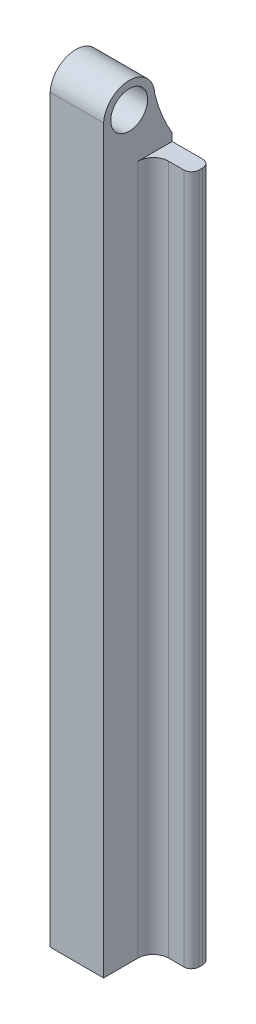
ISO-10303-21;
HEADER;
FILE_DESCRIPTION(('STEP AP214'),'2;1');
FILE_NAME('part.step','',(''),(''),'','','');
FILE_SCHEMA(('AUTOMOTIVE_DESIGN { 1 0 10303 214 1 1 1 1 }'));
ENDSEC;
DATA;
#1=APPLICATION_CONTEXT('core data for automotive mechanical design processes');
#2=APPLICATION_PROTOCOL_DEFINITION('international standard','automotive_design',2000,#1);
#3=PRODUCT_CONTEXT('',#1,'mechanical');
#4=PRODUCT('Part','Part','',(#3));
#5=PRODUCT_RELATED_PRODUCT_CATEGORY('part','',(#4));
#6=PRODUCT_DEFINITION_FORMATION('','',#4);
#7=PRODUCT_DEFINITION_CONTEXT('part definition',#1,'design');
#8=PRODUCT_DEFINITION('design','',#6,#7);
#9=PRODUCT_DEFINITION_SHAPE('','',#8);
#10=(LENGTH_UNIT() NAMED_UNIT(*) SI_UNIT(.MILLI.,.METRE.));
#11=(NAMED_UNIT(*) PLANE_ANGLE_UNIT() SI_UNIT($,.RADIAN.));
#12=(NAMED_UNIT(*) SI_UNIT($,.STERADIAN.) SOLID_ANGLE_UNIT());
#13=UNCERTAINTY_MEASURE_WITH_UNIT(LENGTH_MEASURE(1.E-05),#10,'distance_accuracy_value','');
#14=(GEOMETRIC_REPRESENTATION_CONTEXT(3) GLOBAL_UNCERTAINTY_ASSIGNED_CONTEXT((#13)) GLOBAL_UNIT_ASSIGNED_CONTEXT((#10,
#11,#12)) REPRESENTATION_CONTEXT('',''));
#15=CARTESIAN_POINT('',(0.,0.,0.));
#16=DIRECTION('',(0.,0.,1.));
#17=DIRECTION('',(1.,0.,0.));
#18=AXIS2_PLACEMENT_3D('',#15,#16,#17);
#19=CARTESIAN_POINT('',(0.,154.432,11.43));
#20=DIRECTION('',(-1.,0.,0.));
#21=DIRECTION('',(0.,0.,1.));
#22=AXIS2_PLACEMENT_3D('',#19,#20,#21);
#23=PLANE('',#22);
#24=DIRECTION('',(0.,0.,-1.));
#25=VECTOR('',#24,1.);
#26=CARTESIAN_POINT('',(0.,141.732,11.43));
#27=LINE('',#26,#25);
#28=CARTESIAN_POINT('',(0.,141.732,1.87439950990867));
#29=VERTEX_POINT('',#28);
#30=CARTESIAN_POINT('',(0.,141.732,1.27));
#31=VERTEX_POINT('',#30);
#32=EDGE_CURVE('E373',#29,#31,#27,.T.);
#33=ORIENTED_EDGE('',*,*,#32,.F.);
#34=DIRECTION('',(0.,1.,0.));
#35=VECTOR('',#34,1.);
#36=CARTESIAN_POINT('',(0.,0.,1.87439950990867));
#37=LINE('',#36,#35);
#38=CARTESIAN_POINT('',(0.,26.67,1.87439950990867));
#39=VERTEX_POINT('',#38);
#40=EDGE_CURVE('E257',#29,#39,#37,.F.);
#41=ORIENTED_EDGE('',*,*,#40,.T.);
#42=DIRECTION('',(0.,0.,1.));
#43=VECTOR('',#42,1.);
#44=CARTESIAN_POINT('',(0.,26.67,0.));
#45=LINE('',#44,#43);
#46=CARTESIAN_POINT('',(0.,26.67,1.27));
#47=VERTEX_POINT('',#46);
#48=EDGE_CURVE('E360',#47,#39,#45,.T.);
#49=ORIENTED_EDGE('',*,*,#48,.F.);
#50=DIRECTION('',(0.,-1.,0.));
#51=VECTOR('',#50,1.);
#52=CARTESIAN_POINT('',(0.,154.432,1.27));
#53=LINE('',#52,#51);
#54=EDGE_CURVE('E339',#47,#31,#53,.F.);
#55=ORIENTED_EDGE('',*,*,#54,.T.);
#56=EDGE_LOOP('',(#33,#41,#49,#55));
#57=FACE_BOUND('',#56,.T.);
#58=ADVANCED_FACE('F35',(#57),#23,.F.);
#59=CARTESIAN_POINT('',(0.,154.432,0.));
#60=DIRECTION('',(0.,0.,1.));
#61=DIRECTION('',(1.,0.,0.));
#62=AXIS2_PLACEMENT_3D('',#59,#60,#61);
#63=PLANE('',#62);
#64=DIRECTION('',(0.,-1.,0.));
#65=VECTOR('',#64,1.);
#66=CARTESIAN_POINT('',(-15.2731717145884,154.432,0.));
#67=LINE('',#66,#65);
#68=CARTESIAN_POINT('',(-15.2731717145884,143.002,0.));
#69=VERTEX_POINT('',#68);
#70=CARTESIAN_POINT('',(-15.2731717145884,141.732,0.));
#71=VERTEX_POINT('',#70);
#72=EDGE_CURVE('E380',#69,#71,#67,.T.);
#73=ORIENTED_EDGE('',*,*,#72,.F.);
#74=DIRECTION('',(1.,0.,0.));
#75=VECTOR('',#74,1.);
#76=CARTESIAN_POINT('',(-196.96148304681,143.002,0.));
#77=LINE('',#76,#75);
#78=CARTESIAN_POINT('',(-6.36373498617226,143.002,0.));
#79=VERTEX_POINT('',#78);
#80=EDGE_CURVE('E172',#69,#79,#77,.T.);
#81=ORIENTED_EDGE('',*,*,#80,.T.);
#82=DIRECTION('',(0.,-1.,0.));
#83=VECTOR('',#82,1.);
#84=CARTESIAN_POINT('',(-6.36373498617226,154.432,0.));
#85=LINE('',#84,#83);
#86=CARTESIAN_POINT('',(-6.36373498617226,141.732,0.));
#87=VERTEX_POINT('',#86);
#88=EDGE_CURVE('E161',#79,#87,#85,.T.);
#89=ORIENTED_EDGE('',*,*,#88,.T.);
#90=DIRECTION('',(1.,0.,0.));
#91=VECTOR('',#90,1.);
#92=CARTESIAN_POINT('',(-6.36373498617226,141.732,0.));
#93=LINE('',#92,#91);
#94=CARTESIAN_POINT('',(-1.27,141.732,0.));
#95=VERTEX_POINT('',#94);
#96=EDGE_CURVE('E398',#87,#95,#93,.T.);
#97=ORIENTED_EDGE('',*,*,#96,.T.);
#98=DIRECTION('',(0.,-1.,0.));
#99=VECTOR('',#98,1.);
#100=CARTESIAN_POINT('',(-1.27,154.432,0.));
#101=LINE('',#100,#99);
#102=CARTESIAN_POINT('',(-1.27,26.67,0.));
#103=VERTEX_POINT('',#102);
#104=EDGE_CURVE('E337',#95,#103,#101,.T.);
#105=ORIENTED_EDGE('',*,*,#104,.T.);
#106=DIRECTION('',(1.,0.,0.));
#107=VECTOR('',#106,1.);
#108=CARTESIAN_POINT('',(-21.5957535189019,26.67,0.));
#109=LINE('',#108,#107);
#110=CARTESIAN_POINT('',(-20.3257535189019,26.67,0.));
#111=VERTEX_POINT('',#110);
#112=EDGE_CURVE('E299',#111,#103,#109,.T.);
#113=ORIENTED_EDGE('',*,*,#112,.F.);
#114=DIRECTION('',(0.,-1.,0.));
#115=VECTOR('',#114,1.);
#116=CARTESIAN_POINT('',(-20.3257535189019,154.432,0.));
#117=LINE('',#116,#115);
#118=CARTESIAN_POINT('',(-20.3257535189019,141.732,0.));
#119=VERTEX_POINT('',#118);
#120=EDGE_CURVE('E334',#111,#119,#117,.F.);
#121=ORIENTED_EDGE('',*,*,#120,.T.);
#122=DIRECTION('',(-1.,0.,0.));
#123=VECTOR('',#122,1.);
#124=CARTESIAN_POINT('',(-15.2731717145884,141.732,0.));
#125=LINE('',#124,#123);
#126=EDGE_CURVE('E382',#71,#119,#125,.T.);
#127=ORIENTED_EDGE('',*,*,#126,.F.);
#128=EDGE_LOOP('',(#73,#81,#89,#97,#105,#113,#121,#127));
#129=FACE_BOUND('',#128,.T.);
#130=ADVANCED_FACE('F216',(#129),#63,.F.);
#131=CARTESIAN_POINT('',(-6.36373498617226,-30.48,3.14439950990867));
#132=DIRECTION('',(0.,0.,1.));
#133=DIRECTION('',(1.,0.,0.));
#134=AXIS2_PLACEMENT_3D('',#131,#132,#133);
#135=PLANE('',#134);
#136=DIRECTION('',(0.,1.,0.));
#137=VECTOR('',#136,1.);
#138=CARTESIAN_POINT('',(-1.27,154.432,3.14439950990867));
#139=LINE('',#138,#137);
#140=CARTESIAN_POINT('',(-1.27,26.67,3.14439950990867));
#141=VERTEX_POINT('',#140);
#142=CARTESIAN_POINT('',(-1.27,141.732,3.14439950990867));
#143=VERTEX_POINT('',#142);
#144=EDGE_CURVE('E265',#141,#143,#139,.T.);
#145=ORIENTED_EDGE('',*,*,#144,.T.);
#146=DIRECTION('',(-1.,0.,0.));
#147=VECTOR('',#146,1.);
#148=CARTESIAN_POINT('',(-6.36373498617226,141.732,3.14439950990867));
#149=LINE('',#148,#147);
#150=CARTESIAN_POINT('',(-3.82373498617226,141.732,3.14439950990867));
#151=VERTEX_POINT('',#150);
#152=EDGE_CURVE('E347',#143,#151,#149,.T.);
#153=ORIENTED_EDGE('',*,*,#152,.T.);
#154=DIRECTION('',(0.,1.,0.));
#155=VECTOR('',#154,1.);
#156=CARTESIAN_POINT('',(-3.82373498617226,0.,3.14439950990867));
#157=LINE('',#156,#155);
#158=CARTESIAN_POINT('',(-3.82373498617226,26.67,3.14439950990867));
#159=VERTEX_POINT('',#158);
#160=EDGE_CURVE('E270',#151,#159,#157,.F.);
#161=ORIENTED_EDGE('',*,*,#160,.T.);
#162=DIRECTION('',(1.,0.,0.));
#163=VECTOR('',#162,1.);
#164=CARTESIAN_POINT('',(-6.36373498617226,26.67,3.14439950990867));
#165=LINE('',#164,#163);
#166=EDGE_CURVE('E304',#159,#141,#165,.T.);
#167=ORIENTED_EDGE('',*,*,#166,.T.);
#168=EDGE_LOOP('',(#145,#153,#161,#167));
#169=FACE_BOUND('',#168,.T.);
#170=ADVANCED_FACE('F212',(#169),#135,.T.);
#171=CARTESIAN_POINT('',(-1.27,154.432,1.27));
#172=DIRECTION('',(0.,-1.,0.));
#173=DIRECTION('',(0.,0.,-1.));
#174=AXIS2_PLACEMENT_3D('',#171,#172,#173);
#175=CYLINDRICAL_SURFACE('',#174,1.27);
#176=ORIENTED_EDGE('',*,*,#104,.F.);
#177=CARTESIAN_POINT('',(-1.27,141.732,1.27));
#178=DIRECTION('',(0.,1.,0.));
#179=DIRECTION('',(0.,0.,1.));
#180=AXIS2_PLACEMENT_3D('',#177,#178,#179);
#181=CIRCLE('',#180,1.27);
#182=EDGE_CURVE('E372',#95,#31,#181,.F.);
#183=ORIENTED_EDGE('',*,*,#182,.T.);
#184=ORIENTED_EDGE('',*,*,#54,.F.);
#185=CARTESIAN_POINT('',(-1.27,26.67,1.27));
#186=DIRECTION('',(0.,-1.,0.));
#187=DIRECTION('',(0.,0.,-1.));
#188=AXIS2_PLACEMENT_3D('',#185,#186,#187);
#189=CIRCLE('',#188,1.27);
#190=EDGE_CURVE('E312',#47,#103,#189,.F.);
#191=ORIENTED_EDGE('',*,*,#190,.T.);
#192=EDGE_LOOP('',(#176,#183,#184,#191));
#193=FACE_BOUND('',#192,.T.);
#194=ADVANCED_FACE('F215',(#193),#175,.T.);
#195=CARTESIAN_POINT('',(-3.82373498617226,-30.48,5.68439950990867));
#196=DIRECTION('',(0.,-1.,0.));
#197=DIRECTION('',(0.,0.,-1.));
#198=AXIS2_PLACEMENT_3D('',#195,#196,#197);
#199=CYLINDRICAL_SURFACE('',#198,2.54);
#200=CARTESIAN_POINT('',(-3.82373498617226,141.732,5.68439950990867));
#201=DIRECTION('',(0.,1.,0.));
#202=DIRECTION('',(0.,0.,1.));
#203=AXIS2_PLACEMENT_3D('',#200,#201,#202);
#204=CIRCLE('',#203,2.54);
#205=CARTESIAN_POINT('',(-6.36373498617225,141.732,5.68439950990867));
#206=VERTEX_POINT('',#205);
#207=EDGE_CURVE('E352',#206,#151,#204,.F.);
#208=ORIENTED_EDGE('',*,*,#207,.F.);
#209=DIRECTION('',(0.,1.,0.));
#210=VECTOR('',#209,1.);
#211=CARTESIAN_POINT('',(-6.36373498617226,154.432,5.68439950990867));
#212=LINE('',#211,#210);
#213=CARTESIAN_POINT('',(-6.36373498617226,26.67,5.68439950990867));
#214=VERTEX_POINT('',#213);
#215=EDGE_CURVE('E342',#214,#206,#212,.T.);
#216=ORIENTED_EDGE('',*,*,#215,.F.);
#217=CARTESIAN_POINT('',(-3.82373498617226,26.67,5.68439950990867));
#218=DIRECTION('',(0.,-1.,0.));
#219=DIRECTION('',(0.,0.,-1.));
#220=AXIS2_PLACEMENT_3D('',#217,#218,#219);
#221=CIRCLE('',#220,2.54);
#222=EDGE_CURVE('E307',#159,#214,#221,.F.);
#223=ORIENTED_EDGE('',*,*,#222,.F.);
#224=ORIENTED_EDGE('',*,*,#160,.F.);
#225=EDGE_LOOP('',(#208,#216,#223,#224));
#226=FACE_BOUND('',#225,.T.);
#227=ADVANCED_FACE('F246',(#226),#199,.F.);
#228=CARTESIAN_POINT('',(-1.27,-30.48,1.87439950990867));
#229=DIRECTION('',(0.,-1.,0.));
#230=DIRECTION('',(0.,0.,-1.));
#231=AXIS2_PLACEMENT_3D('',#228,#229,#230);
#232=CYLINDRICAL_SURFACE('',#231,1.27);
#233=ORIENTED_EDGE('',*,*,#40,.F.);
#234=CARTESIAN_POINT('',(-1.27,141.732,1.87439950990867));
#235=DIRECTION('',(0.,1.,0.));
#236=DIRECTION('',(0.,0.,1.));
#237=AXIS2_PLACEMENT_3D('',#234,#235,#236);
#238=CIRCLE('',#237,1.27);
#239=EDGE_CURVE('E170',#29,#143,#238,.F.);
#240=ORIENTED_EDGE('',*,*,#239,.T.);
#241=ORIENTED_EDGE('',*,*,#144,.F.);
#242=CARTESIAN_POINT('',(-1.27,26.67,1.87439950990867));
#243=DIRECTION('',(0.,-1.,0.));
#244=DIRECTION('',(0.,0.,-1.));
#245=AXIS2_PLACEMENT_3D('',#242,#243,#244);
#246=CIRCLE('',#245,1.27);
#247=EDGE_CURVE('E260',#141,#39,#246,.F.);
#248=ORIENTED_EDGE('',*,*,#247,.T.);
#249=EDGE_LOOP('',(#233,#240,#241,#248));
#250=FACE_BOUND('',#249,.T.);
#251=ADVANCED_FACE('F206',(#250),#232,.T.);
#252=CARTESIAN_POINT('',(11.8116419603877,149.86,7.16202492046611));
#253=DIRECTION('',(-1.,0.,0.));
#254=DIRECTION('',(0.,0.,1.));
#255=AXIS2_PLACEMENT_3D('',#252,#253,#254);
#256=CYLINDRICAL_SURFACE('',#255,3.07576047301849);
#257=CARTESIAN_POINT('',(-15.2731717145884,149.86,7.16202492046611));
#258=DIRECTION('',(-1.,0.,0.));
#259=DIRECTION('',(0.,0.,1.));
#260=AXIS2_PLACEMENT_3D('',#257,#258,#259);
#261=CIRCLE('',#260,3.07576047301849);
#262=CARTESIAN_POINT('',(-15.2731717145884,149.86,10.2377853934846));
#263=VERTEX_POINT('',#262);
#264=EDGE_CURVE('E318',#263,#263,#261,.T.);
#265=ORIENTED_EDGE('',*,*,#264,.T.);
#266=EDGE_LOOP('',(#265));
#267=FACE_BOUND('',#266,.T.);
#268=CARTESIAN_POINT('',(-6.36373498617226,149.86,7.16202492046611));
#269=DIRECTION('',(1.,0.,0.));
#270=DIRECTION('',(0.,0.,-1.));
#271=AXIS2_PLACEMENT_3D('',#268,#269,#270);
#272=CIRCLE('',#271,3.07576047301849);
#273=CARTESIAN_POINT('',(-6.36373498617226,149.86,4.08626444744761));
#274=VERTEX_POINT('',#273);
#275=EDGE_CURVE('E321',#274,#274,#272,.T.);
#276=ORIENTED_EDGE('',*,*,#275,.T.);
#277=EDGE_LOOP('',(#276));
#278=FACE_BOUND('',#277,.T.);
#279=ADVANCED_FACE('F202',(#267,#278),#256,.F.);
#280=CARTESIAN_POINT('',(-21.5957535189019,154.432,11.43));
#281=DIRECTION('',(0.,0.,-1.));
#282=DIRECTION('',(-1.,0.,0.));
#283=AXIS2_PLACEMENT_3D('',#280,#281,#282);
#284=PLANE('',#283);
#285=DIRECTION('',(0.,1.,0.));
#286=VECTOR('',#285,1.);
#287=CARTESIAN_POINT('',(-6.36373498617226,-30.48,11.43));
#288=LINE('',#287,#286);
#289=CARTESIAN_POINT('',(-6.36373498617226,26.67,11.43));
#290=VERTEX_POINT('',#289);
#291=CARTESIAN_POINT('',(-6.36373498617226,150.111040384057,11.43));
#292=VERTEX_POINT('',#291);
#293=EDGE_CURVE('E324',#290,#292,#288,.T.);
#294=ORIENTED_EDGE('',*,*,#293,.T.);
#295=DIRECTION('',(1.,0.,0.));
#296=VECTOR('',#295,1.);
#297=CARTESIAN_POINT('',(-196.96148304681,150.111040384057,11.43));
#298=LINE('',#297,#296);
#299=CARTESIAN_POINT('',(-15.2731717145884,150.111040384057,11.43));
#300=VERTEX_POINT('',#299);
#301=EDGE_CURVE('E169',#292,#300,#298,.F.);
#302=ORIENTED_EDGE('',*,*,#301,.T.);
#303=DIRECTION('',(0.,1.,0.));
#304=VECTOR('',#303,1.);
#305=CARTESIAN_POINT('',(-15.2731717145884,-14.986,11.43));
#306=LINE('',#305,#304);
#307=CARTESIAN_POINT('',(-15.2731717145884,26.67,11.43));
#308=VERTEX_POINT('',#307);
#309=EDGE_CURVE('E326',#308,#300,#306,.T.);
#310=ORIENTED_EDGE('',*,*,#309,.F.);
#311=DIRECTION('',(-1.,0.,0.));
#312=VECTOR('',#311,1.);
#313=CARTESIAN_POINT('',(0.,26.67,11.43));
#314=LINE('',#313,#312);
#315=EDGE_CURVE('E356',#290,#308,#314,.T.);
#316=ORIENTED_EDGE('',*,*,#315,.F.);
#317=EDGE_LOOP('',(#294,#302,#310,#316));
#318=FACE_BOUND('',#317,.T.);
#319=ADVANCED_FACE('F205',(#318),#284,.F.);
#320=CARTESIAN_POINT('',(-21.5957535189019,154.432,0.));
#321=DIRECTION('',(1.,0.,0.));
#322=DIRECTION('',(0.,0.,-1.));
#323=AXIS2_PLACEMENT_3D('',#320,#321,#322);
#324=PLANE('',#323);
#325=DIRECTION('',(0.,1.,0.));
#326=VECTOR('',#325,1.);
#327=CARTESIAN_POINT('',(-21.5957535189019,154.432,1.82012425482083));
#328=LINE('',#327,#326);
#329=CARTESIAN_POINT('',(-21.5957535189019,26.67,1.82012425482083));
#330=VERTEX_POINT('',#329);
#331=CARTESIAN_POINT('',(-21.5957535189019,141.732,1.82012425482083));
#332=VERTEX_POINT('',#331);
#333=EDGE_CURVE('E328',#330,#332,#328,.T.);
#334=ORIENTED_EDGE('',*,*,#333,.T.);
#335=DIRECTION('',(0.,0.,-1.));
#336=VECTOR('',#335,1.);
#337=CARTESIAN_POINT('',(-21.5957535189019,141.732,0.));
#338=LINE('',#337,#336);
#339=CARTESIAN_POINT('',(-21.5957535189019,141.732,1.27));
#340=VERTEX_POINT('',#339);
#341=EDGE_CURVE('E389',#332,#340,#338,.T.);
#342=ORIENTED_EDGE('',*,*,#341,.T.);
#343=DIRECTION('',(0.,-1.,0.));
#344=VECTOR('',#343,1.);
#345=CARTESIAN_POINT('',(-21.5957535189019,154.432,1.27));
#346=LINE('',#345,#344);
#347=CARTESIAN_POINT('',(-21.5957535189019,26.67,1.27));
#348=VERTEX_POINT('',#347);
#349=EDGE_CURVE('E332',#340,#348,#346,.T.);
#350=ORIENTED_EDGE('',*,*,#349,.T.);
#351=DIRECTION('',(0.,0.,-1.));
#352=VECTOR('',#351,1.);
#353=CARTESIAN_POINT('',(-21.5957535189019,26.67,11.43));
#354=LINE('',#353,#352);
#355=EDGE_CURVE('E359',#330,#348,#354,.T.);
#356=ORIENTED_EDGE('',*,*,#355,.F.);
#357=EDGE_LOOP('',(#334,#342,#350,#356));
#358=FACE_BOUND('',#357,.T.);
#359=ADVANCED_FACE('F223',(#358),#324,.F.);
#360=CARTESIAN_POINT('',(-15.2731717145884,-14.986,3.09012425482083));
#361=DIRECTION('',(0.,0.,-1.));
#362=DIRECTION('',(-1.,0.,0.));
#363=AXIS2_PLACEMENT_3D('',#360,#361,#362);
#364=PLANE('',#363);
#365=DIRECTION('',(0.,1.,0.));
#366=VECTOR('',#365,1.);
#367=CARTESIAN_POINT('',(-17.8131717145884,154.432,3.09012425482083));
#368=LINE('',#367,#366);
#369=CARTESIAN_POINT('',(-17.8131717145884,26.67,3.09012425482083));
#370=VERTEX_POINT('',#369);
#371=CARTESIAN_POINT('',(-17.8131717145884,141.732,3.09012425482083));
#372=VERTEX_POINT('',#371);
#373=EDGE_CURVE('E264',#370,#372,#368,.T.);
#374=ORIENTED_EDGE('',*,*,#373,.T.);
#375=DIRECTION('',(-1.,0.,0.));
#376=VECTOR('',#375,1.);
#377=CARTESIAN_POINT('',(-15.2731717145884,141.732,3.09012425482083));
#378=LINE('',#377,#376);
#379=CARTESIAN_POINT('',(-20.3257535189019,141.732,3.09012425482083));
#380=VERTEX_POINT('',#379);
#381=EDGE_CURVE('E288',#372,#380,#378,.T.);
#382=ORIENTED_EDGE('',*,*,#381,.T.);
#383=DIRECTION('',(0.,1.,0.));
#384=VECTOR('',#383,1.);
#385=CARTESIAN_POINT('',(-20.3257535189019,-14.986,3.09012425482083));
#386=LINE('',#385,#384);
#387=CARTESIAN_POINT('',(-20.3257535189019,26.67,3.09012425482083));
#388=VERTEX_POINT('',#387);
#389=EDGE_CURVE('E292',#380,#388,#386,.F.);
#390=ORIENTED_EDGE('',*,*,#389,.T.);
#391=DIRECTION('',(-1.,0.,0.));
#392=VECTOR('',#391,1.);
#393=CARTESIAN_POINT('',(-15.2731717145884,26.67,3.09012425482083));
#394=LINE('',#393,#392);
#395=EDGE_CURVE('E291',#370,#388,#394,.T.);
#396=ORIENTED_EDGE('',*,*,#395,.F.);
#397=EDGE_LOOP('',(#374,#382,#390,#396));
#398=FACE_BOUND('',#397,.T.);
#399=ADVANCED_FACE('F220',(#398),#364,.F.);
#400=CARTESIAN_POINT('',(-15.2731717145884,-14.986,11.43));
#401=DIRECTION('',(1.,0.,0.));
#402=DIRECTION('',(0.,0.,-1.));
#403=AXIS2_PLACEMENT_3D('',#400,#401,#402);
#404=PLANE('',#403);
#405=CARTESIAN_POINT('',(-15.2731717145884,149.86,7.16202492046611));
#406=DIRECTION('',(1.,0.,0.));
#407=DIRECTION('',(0.,0.,-1.));
#408=AXIS2_PLACEMENT_3D('',#405,#406,#407);
#409=CIRCLE('',#408,4.27535174622508);
#410=CARTESIAN_POINT('',(-15.2731717145884,149.988191265736,2.88859543662775));
#411=VERTEX_POINT('',#410);
#412=EDGE_CURVE('E52',#411,#300,#409,.T.);
#413=ORIENTED_EDGE('',*,*,#412,.F.);
#414=CARTESIAN_POINT('',(-15.2731717145884,149.988191265736,2.88859543662775));
#415=CARTESIAN_POINT('',(-15.2731717145884,146.270696911558,1.96589453571932));
#416=CARTESIAN_POINT('',(-15.2731717145884,143.002,0.));
#417=B_SPLINE_CURVE_WITH_KNOTS('',2,(#414,#415,#416),.UNSPECIFIED.,.F.,.F.,(3,3),(0.,1.),.UNSPECIFIED.);
#418=EDGE_CURVE('E57',#69,#411,#417,.F.);
#419=ORIENTED_EDGE('',*,*,#418,.F.);
#420=ORIENTED_EDGE('',*,*,#72,.T.);
#421=DIRECTION('',(0.,0.,-1.));
#422=VECTOR('',#421,1.);
#423=CARTESIAN_POINT('',(-15.2731717145884,141.732,11.43));
#424=LINE('',#423,#422);
#425=CARTESIAN_POINT('',(-15.2731717145884,141.732,5.63012425482083));
#426=VERTEX_POINT('',#425);
#427=EDGE_CURVE('E384',#426,#71,#424,.T.);
#428=ORIENTED_EDGE('',*,*,#427,.F.);
#429=DIRECTION('',(0.,1.,0.));
#430=VECTOR('',#429,1.);
#431=CARTESIAN_POINT('',(-15.2731717145884,0.,5.63012425482083));
#432=LINE('',#431,#430);
#433=CARTESIAN_POINT('',(-15.2731717145884,26.67,5.63012425482083));
#434=VERTEX_POINT('',#433);
#435=EDGE_CURVE('E268',#426,#434,#432,.F.);
#436=ORIENTED_EDGE('',*,*,#435,.T.);
#437=DIRECTION('',(0.,0.,-1.));
#438=VECTOR('',#437,1.);
#439=CARTESIAN_POINT('',(-15.2731717145884,26.67,11.43));
#440=LINE('',#439,#438);
#441=EDGE_CURVE('E295',#308,#434,#440,.T.);
#442=ORIENTED_EDGE('',*,*,#441,.F.);
#443=ORIENTED_EDGE('',*,*,#309,.T.);
#444=EDGE_LOOP('',(#413,#419,#420,#428,#436,#442,#443));
#445=FACE_BOUND('',#444,.T.);
#446=ORIENTED_EDGE('',*,*,#264,.F.);
#447=EDGE_LOOP('',(#446));
#448=FACE_BOUND('',#447,.T.);
#449=ADVANCED_FACE('F211',(#445,#448),#404,.F.);
#450=CARTESIAN_POINT('',(-6.36373498617226,-30.48,11.43));
#451=DIRECTION('',(1.,0.,0.));
#452=DIRECTION('',(0.,0.,-1.));
#453=AXIS2_PLACEMENT_3D('',#450,#451,#452);
#454=PLANE('',#453);
#455=CARTESIAN_POINT('',(-6.36373498617226,149.988191265736,2.88859543662775));
#456=CARTESIAN_POINT('',(-6.36373498617226,146.270696911558,1.96589453571932));
#457=CARTESIAN_POINT('',(-6.36373498617226,143.002,0.));
#458=B_SPLINE_CURVE_WITH_KNOTS('',2,(#455,#456,#457),.UNSPECIFIED.,.F.,.F.,(3,3),(0.,1.),.UNSPECIFIED.);
#459=CARTESIAN_POINT('',(-6.36373498617226,149.988191265736,2.88859543662775));
#460=VERTEX_POINT('',#459);
#461=EDGE_CURVE('E11',#460,#79,#458,.T.);
#462=ORIENTED_EDGE('',*,*,#461,.F.);
#463=CARTESIAN_POINT('',(-6.36373498617226,149.86,7.16202492046611));
#464=DIRECTION('',(1.,0.,0.));
#465=DIRECTION('',(0.,0.,-1.));
#466=AXIS2_PLACEMENT_3D('',#463,#464,#465);
#467=CIRCLE('',#466,4.27535174622508);
#468=EDGE_CURVE('E45',#292,#460,#467,.F.);
#469=ORIENTED_EDGE('',*,*,#468,.F.);
#470=ORIENTED_EDGE('',*,*,#293,.F.);
#471=DIRECTION('',(0.,0.,-1.));
#472=VECTOR('',#471,1.);
#473=CARTESIAN_POINT('',(-6.36373498617226,26.67,11.43));
#474=LINE('',#473,#472);
#475=EDGE_CURVE('E309',#290,#214,#474,.T.);
#476=ORIENTED_EDGE('',*,*,#475,.T.);
#477=ORIENTED_EDGE('',*,*,#215,.T.);
#478=DIRECTION('',(0.,0.,-1.));
#479=VECTOR('',#478,1.);
#480=CARTESIAN_POINT('',(-6.36373498617226,141.732,11.43));
#481=LINE('',#480,#479);
#482=EDGE_CURVE('E353',#206,#87,#481,.T.);
#483=ORIENTED_EDGE('',*,*,#482,.T.);
#484=ORIENTED_EDGE('',*,*,#88,.F.);
#485=EDGE_LOOP('',(#462,#469,#470,#476,#477,#483,#484));
#486=FACE_BOUND('',#485,.T.);
#487=ORIENTED_EDGE('',*,*,#275,.F.);
#488=EDGE_LOOP('',(#487));
#489=FACE_BOUND('',#488,.T.);
#490=ADVANCED_FACE('F156',(#486,#489),#454,.T.);
#491=CARTESIAN_POINT('',(-20.3257535189019,154.432,1.82012425482083));
#492=DIRECTION('',(0.,1.,0.));
#493=DIRECTION('',(0.,0.,1.));
#494=AXIS2_PLACEMENT_3D('',#491,#492,#493);
#495=CYLINDRICAL_SURFACE('',#494,1.27);
#496=CARTESIAN_POINT('',(-20.3257535189019,141.732,1.82012425482083));
#497=DIRECTION('',(0.,-1.,0.));
#498=DIRECTION('',(0.,0.,-1.));
#499=AXIS2_PLACEMENT_3D('',#496,#497,#498);
#500=CIRCLE('',#499,1.27);
#501=EDGE_CURVE('E387',#332,#380,#500,.F.);
#502=ORIENTED_EDGE('',*,*,#501,.F.);
#503=ORIENTED_EDGE('',*,*,#333,.F.);
#504=CARTESIAN_POINT('',(-20.3257535189019,26.67,1.82012425482083));
#505=DIRECTION('',(0.,-1.,0.));
#506=DIRECTION('',(0.,0.,-1.));
#507=AXIS2_PLACEMENT_3D('',#504,#505,#506);
#508=CIRCLE('',#507,1.27);
#509=EDGE_CURVE('E294',#330,#388,#508,.F.);
#510=ORIENTED_EDGE('',*,*,#509,.T.);
#511=ORIENTED_EDGE('',*,*,#389,.F.);
#512=EDGE_LOOP('',(#502,#503,#510,#511));
#513=FACE_BOUND('',#512,.T.);
#514=ADVANCED_FACE('F210',(#513),#495,.T.);
#515=CARTESIAN_POINT('',(-20.3257535189019,154.432,1.27));
#516=DIRECTION('',(0.,-1.,0.));
#517=DIRECTION('',(0.,0.,-1.));
#518=AXIS2_PLACEMENT_3D('',#515,#516,#517);
#519=CYLINDRICAL_SURFACE('',#518,1.27);
#520=CARTESIAN_POINT('',(-20.3257535189019,141.732,1.27));
#521=DIRECTION('',(0.,-1.,0.));
#522=DIRECTION('',(0.,0.,-1.));
#523=AXIS2_PLACEMENT_3D('',#520,#521,#522);
#524=CIRCLE('',#523,1.27);
#525=EDGE_CURVE('E364',#119,#340,#524,.F.);
#526=ORIENTED_EDGE('',*,*,#525,.F.);
#527=ORIENTED_EDGE('',*,*,#120,.F.);
#528=CARTESIAN_POINT('',(-20.3257535189019,26.67,1.27));
#529=DIRECTION('',(0.,-1.,0.));
#530=DIRECTION('',(0.,0.,-1.));
#531=AXIS2_PLACEMENT_3D('',#528,#529,#530);
#532=CIRCLE('',#531,1.27);
#533=EDGE_CURVE('E315',#111,#348,#532,.F.);
#534=ORIENTED_EDGE('',*,*,#533,.T.);
#535=ORIENTED_EDGE('',*,*,#349,.F.);
#536=EDGE_LOOP('',(#526,#527,#534,#535));
#537=FACE_BOUND('',#536,.T.);
#538=ADVANCED_FACE('F239',(#537),#519,.T.);
#539=CARTESIAN_POINT('',(-17.8131717145884,-14.986,5.63012425482083));
#540=DIRECTION('',(0.,-1.,0.));
#541=DIRECTION('',(0.,0.,-1.));
#542=AXIS2_PLACEMENT_3D('',#539,#540,#541);
#543=CYLINDRICAL_SURFACE('',#542,2.54);
#544=ORIENTED_EDGE('',*,*,#435,.F.);
#545=CARTESIAN_POINT('',(-17.8131717145884,141.732,5.63012425482083));
#546=DIRECTION('',(0.,-1.,0.));
#547=DIRECTION('',(0.,0.,-1.));
#548=AXIS2_PLACEMENT_3D('',#545,#546,#547);
#549=CIRCLE('',#548,2.54);
#550=EDGE_CURVE('E277',#426,#372,#549,.F.);
#551=ORIENTED_EDGE('',*,*,#550,.T.);
#552=ORIENTED_EDGE('',*,*,#373,.F.);
#553=CARTESIAN_POINT('',(-17.8131717145884,26.67,5.63012425482083));
#554=DIRECTION('',(0.,-1.,0.));
#555=DIRECTION('',(0.,0.,-1.));
#556=AXIS2_PLACEMENT_3D('',#553,#554,#555);
#557=CIRCLE('',#556,2.54);
#558=EDGE_CURVE('E275',#434,#370,#557,.F.);
#559=ORIENTED_EDGE('',*,*,#558,.F.);
#560=EDGE_LOOP('',(#544,#551,#552,#559));
#561=FACE_BOUND('',#560,.T.);
#562=ADVANCED_FACE('F37',(#561),#543,.F.);
#563=CARTESIAN_POINT('',(0.,26.67,0.));
#564=DIRECTION('',(0.,-1.,0.));
#565=DIRECTION('',(0.,0.,-1.));
#566=AXIS2_PLACEMENT_3D('',#563,#564,#565);
#567=PLANE('',#566);
#568=ORIENTED_EDGE('',*,*,#112,.T.);
#569=ORIENTED_EDGE('',*,*,#190,.F.);
#570=ORIENTED_EDGE('',*,*,#48,.T.);
#571=ORIENTED_EDGE('',*,*,#247,.F.);
#572=ORIENTED_EDGE('',*,*,#166,.F.);
#573=ORIENTED_EDGE('',*,*,#222,.T.);
#574=ORIENTED_EDGE('',*,*,#475,.F.);
#575=ORIENTED_EDGE('',*,*,#315,.T.);
#576=ORIENTED_EDGE('',*,*,#441,.T.);
#577=ORIENTED_EDGE('',*,*,#558,.T.);
#578=ORIENTED_EDGE('',*,*,#395,.T.);
#579=ORIENTED_EDGE('',*,*,#509,.F.);
#580=ORIENTED_EDGE('',*,*,#355,.T.);
#581=ORIENTED_EDGE('',*,*,#533,.F.);
#582=EDGE_LOOP('',(#568,#569,#570,#571,#572,#573,#574,#575,#576,#577,#578,#579,#580,#581));
#583=FACE_BOUND('',#582,.T.);
#584=ADVANCED_FACE('F197',(#583),#567,.T.);
#585=CARTESIAN_POINT('',(-15.2731717145884,141.732,11.43));
#586=DIRECTION('',(0.,-1.,0.));
#587=DIRECTION('',(0.,0.,-1.));
#588=AXIS2_PLACEMENT_3D('',#585,#586,#587);
#589=PLANE('',#588);
#590=ORIENTED_EDGE('',*,*,#525,.T.);
#591=ORIENTED_EDGE('',*,*,#341,.F.);
#592=ORIENTED_EDGE('',*,*,#501,.T.);
#593=ORIENTED_EDGE('',*,*,#381,.F.);
#594=ORIENTED_EDGE('',*,*,#550,.F.);
#595=ORIENTED_EDGE('',*,*,#427,.T.);
#596=ORIENTED_EDGE('',*,*,#126,.T.);
#597=EDGE_LOOP('',(#590,#591,#592,#593,#594,#595,#596));
#598=FACE_BOUND('',#597,.T.);
#599=ADVANCED_FACE('F193',(#598),#589,.F.);
#600=CARTESIAN_POINT('',(-6.36373498617226,141.732,11.43));
#601=DIRECTION('',(0.,1.,0.));
#602=DIRECTION('',(0.,0.,1.));
#603=AXIS2_PLACEMENT_3D('',#600,#601,#602);
#604=PLANE('',#603);
#605=ORIENTED_EDGE('',*,*,#96,.F.);
#606=ORIENTED_EDGE('',*,*,#482,.F.);
#607=ORIENTED_EDGE('',*,*,#207,.T.);
#608=ORIENTED_EDGE('',*,*,#152,.F.);
#609=ORIENTED_EDGE('',*,*,#239,.F.);
#610=ORIENTED_EDGE('',*,*,#32,.T.);
#611=ORIENTED_EDGE('',*,*,#182,.F.);
#612=EDGE_LOOP('',(#605,#606,#607,#608,#609,#610,#611));
#613=FACE_BOUND('',#612,.T.);
#614=ADVANCED_FACE('F190',(#613),#604,.T.);
#615=CARTESIAN_POINT('',(-196.96148304681,149.86,7.16202492046611));
#616=DIRECTION('',(1.,0.,0.));
#617=DIRECTION('',(0.,0.,-1.));
#618=AXIS2_PLACEMENT_3D('',#615,#616,#617);
#619=CYLINDRICAL_SURFACE('',#618,4.27535174622508);
#620=ORIENTED_EDGE('',*,*,#301,.F.);
#621=ORIENTED_EDGE('',*,*,#468,.T.);
#622=DIRECTION('',(1.,0.,0.));
#623=VECTOR('',#622,1.);
#624=CARTESIAN_POINT('',(-196.96148304681,149.988191265736,2.88859543662775));
#625=LINE('',#624,#623);
#626=EDGE_CURVE('E167',#411,#460,#625,.T.);
#627=ORIENTED_EDGE('',*,*,#626,.F.);
#628=ORIENTED_EDGE('',*,*,#412,.T.);
#629=EDGE_LOOP('',(#620,#621,#627,#628));
#630=FACE_BOUND('',#629,.T.);
#631=ADVANCED_FACE('F166',(#630),#619,.T.);
#632=CARTESIAN_POINT('',(-196.96148304681,149.988191265736,2.88859543662775));
#633=CARTESIAN_POINT('',(-196.96148304681,146.270696911558,1.96589453571932));
#634=CARTESIAN_POINT('',(-196.96148304681,143.002,0.));
#635=B_SPLINE_CURVE_WITH_KNOTS('',2,(#632,#633,#634),.UNSPECIFIED.,.F.,.F.,(3,3),(0.,1.),.UNSPECIFIED.);
#636=DIRECTION('',(1.,0.,0.));
#637=VECTOR('',#636,1.);
#638=SURFACE_OF_LINEAR_EXTRUSION('',#635,#637);
#639=ORIENTED_EDGE('',*,*,#626,.T.);
#640=ORIENTED_EDGE('',*,*,#461,.T.);
#641=ORIENTED_EDGE('',*,*,#80,.F.);
#642=ORIENTED_EDGE('',*,*,#418,.T.);
#643=EDGE_LOOP('',(#639,#640,#641,#642));
#644=FACE_BOUND('',#643,.T.);
#645=ADVANCED_FACE('F171',(#644),#638,.F.);
#646=CLOSED_SHELL('',(#58,#130,#170,#194,#227,#251,#279,#319,#359,#399,#449,#490,#514,#538,#562,
#584,#599,#614,#631,#645));
#647=MANIFOLD_SOLID_BREP('B2',#646);
#648=ADVANCED_BREP_SHAPE_REPRESENTATION('',(#18,#647),#14);
#649=SHAPE_DEFINITION_REPRESENTATION(#9,#648);
ENDSEC;
END-ISO-10303-21;
